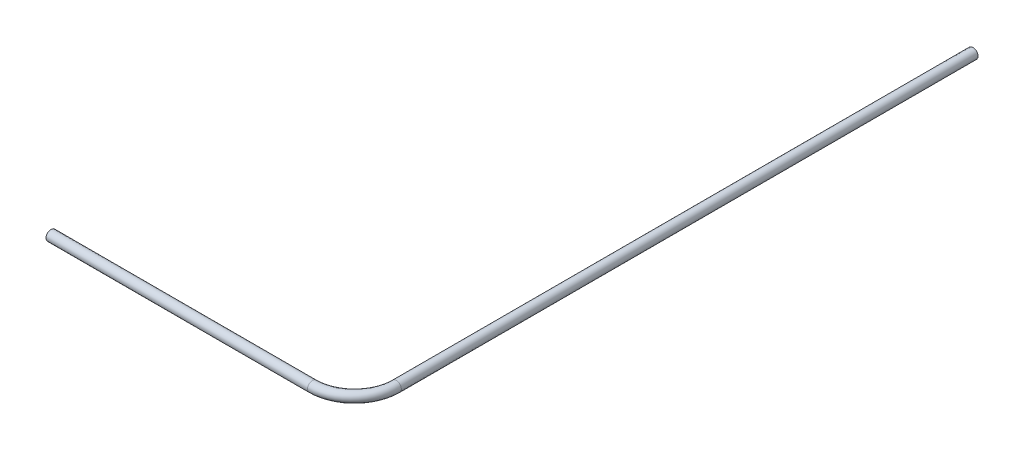
ISO-10303-21;
HEADER;
FILE_DESCRIPTION(('STEP AP214'),'2;1');
FILE_NAME('part.step','',(''),(''),'','','');
FILE_SCHEMA(('AUTOMOTIVE_DESIGN { 1 0 10303 214 1 1 1 1 }'));
ENDSEC;
DATA;
#1=APPLICATION_CONTEXT('core data for automotive mechanical design processes');
#2=APPLICATION_PROTOCOL_DEFINITION('international standard','automotive_design',2000,#1);
#3=PRODUCT_CONTEXT('',#1,'mechanical');
#4=PRODUCT('Part','Part','',(#3));
#5=PRODUCT_RELATED_PRODUCT_CATEGORY('part','',(#4));
#6=PRODUCT_DEFINITION_FORMATION('','',#4);
#7=PRODUCT_DEFINITION_CONTEXT('part definition',#1,'design');
#8=PRODUCT_DEFINITION('design','',#6,#7);
#9=PRODUCT_DEFINITION_SHAPE('','',#8);
#10=(LENGTH_UNIT() NAMED_UNIT(*) SI_UNIT(.MILLI.,.METRE.));
#11=(NAMED_UNIT(*) PLANE_ANGLE_UNIT() SI_UNIT($,.RADIAN.));
#12=(NAMED_UNIT(*) SI_UNIT($,.STERADIAN.) SOLID_ANGLE_UNIT());
#13=UNCERTAINTY_MEASURE_WITH_UNIT(LENGTH_MEASURE(1.E-05),#10,'distance_accuracy_value','');
#14=(GEOMETRIC_REPRESENTATION_CONTEXT(3) GLOBAL_UNCERTAINTY_ASSIGNED_CONTEXT((#13)) GLOBAL_UNIT_ASSIGNED_CONTEXT((#10,
#11,#12)) REPRESENTATION_CONTEXT('',''));
#15=CARTESIAN_POINT('',(0.,0.,0.));
#16=DIRECTION('',(0.,0.,1.));
#17=DIRECTION('',(1.,0.,0.));
#18=AXIS2_PLACEMENT_3D('',#15,#16,#17);
#19=CARTESIAN_POINT('',(11.9999999999996,0.,0.));
#20=DIRECTION('',(0.,0.,1.));
#21=DIRECTION('',(1.,0.,0.));
#22=AXIS2_PLACEMENT_3D('',#19,#20,#21);
#23=PLANE('',#22);
#24=CARTESIAN_POINT('',(11.9999999999996,0.,0.));
#25=DIRECTION('',(0.,0.,1.));
#26=DIRECTION('',(1.,0.,0.));
#27=AXIS2_PLACEMENT_3D('',#24,#25,#26);
#28=CIRCLE('',#27,6.);
#29=CARTESIAN_POINT('',(17.9999999999996,0.,0.));
#30=VERTEX_POINT('',#29);
#31=EDGE_CURVE('E51',#30,#30,#28,.T.);
#32=ORIENTED_EDGE('',*,*,#31,.F.);
#33=EDGE_LOOP('',(#32));
#34=FACE_BOUND('',#33,.T.);
#35=ADVANCED_FACE('F32',(#34),#23,.F.);
#36=CARTESIAN_POINT('',(-350.,-3.10862446895044E-12,738.000000000004));
#37=DIRECTION('',(-1.,0.,0.));
#38=DIRECTION('',(0.,0.,1.));
#39=AXIS2_PLACEMENT_3D('',#36,#37,#38);
#40=PLANE('',#39);
#41=CARTESIAN_POINT('',(-350.,-3.10862446895044E-12,738.000000000004));
#42=DIRECTION('',(-1.,0.,0.));
#43=DIRECTION('',(0.,0.,1.));
#44=AXIS2_PLACEMENT_3D('',#41,#42,#43);
#45=CIRCLE('',#44,6.);
#46=CARTESIAN_POINT('',(-350.,-3.12261327906072E-12,744.000000000004));
#47=VERTEX_POINT('',#46);
#48=EDGE_CURVE('E10',#47,#47,#45,.T.);
#49=ORIENTED_EDGE('',*,*,#48,.T.);
#50=EDGE_LOOP('',(#49));
#51=FACE_BOUND('',#50,.T.);
#52=ADVANCED_FACE('F62',(#51),#40,.T.);
#53=CARTESIAN_POINT('',(11.9999999999996,0.,0.));
#54=DIRECTION('',(0.,0.,1.));
#55=DIRECTION('',(1.,0.,0.));
#56=AXIS2_PLACEMENT_3D('',#53,#54,#55);
#57=CYLINDRICAL_SURFACE('',#56,6.);
#58=CARTESIAN_POINT('',(12.0000000000031,-8.88178419700125E-13,688.000000000001));
#59=DIRECTION('',(0.,0.,1.));
#60=DIRECTION('',(1.,0.,0.));
#61=AXIS2_PLACEMENT_3D('',#58,#59,#60);
#62=CIRCLE('',#61,6.);
#63=CARTESIAN_POINT('',(18.0000000000024,-8.88178419700125E-13,688.000000000001));
#64=VERTEX_POINT('',#63);
#65=EDGE_CURVE('E45',#64,#64,#62,.T.);
#66=ORIENTED_EDGE('',*,*,#65,.F.);
#67=EDGE_LOOP('',(#66));
#68=FACE_BOUND('',#67,.T.);
#69=ORIENTED_EDGE('',*,*,#31,.T.);
#70=EDGE_LOOP('',(#69));
#71=FACE_BOUND('',#70,.T.);
#72=ADVANCED_FACE('F59',(#68,#71),#57,.T.);
#73=CARTESIAN_POINT('',(-37.9999999999976,-8.88178419700125E-13,688.000000000001));
#74=DIRECTION('',(0.,-1.,0.));
#75=DIRECTION('',(0.,0.,-1.));
#76=AXIS2_PLACEMENT_3D('',#73,#74,#75);
#77=TOROIDAL_SURFACE('',#76,50.,6.);
#78=CARTESIAN_POINT('',(-37.9999999999976,-8.88178419700125E-13,738.));
#79=DIRECTION('',(-1.,0.,0.));
#80=DIRECTION('',(0.,0.,1.));
#81=AXIS2_PLACEMENT_3D('',#78,#79,#80);
#82=CIRCLE('',#81,6.);
#83=CARTESIAN_POINT('',(-37.9999999999976,-8.88178419700125E-13,744.000000000001));
#84=VERTEX_POINT('',#83);
#85=EDGE_CURVE('E39',#84,#84,#82,.T.);
#86=CARTESIAN_POINT('',(-37.9999999999976,-8.88178419700125E-13,688.000000000001));
#87=DIRECTION('',(0.,-1.,0.));
#88=DIRECTION('',(0.,0.,-1.));
#89=AXIS2_PLACEMENT_3D('',#86,#87,#88);
#90=CIRCLE('',#89,56.);
#91=EDGE_CURVE('',#64,#84,#90,.T.);
#92=ORIENTED_EDGE('',*,*,#65,.T.);
#93=ORIENTED_EDGE('',*,*,#85,.F.);
#94=ORIENTED_EDGE('',*,*,#91,.T.);
#95=ORIENTED_EDGE('',*,*,#91,.F.);
#96=EDGE_LOOP('',(#92,#94,#93,#95));
#97=FACE_BOUND('',#96,.T.);
#98=ADVANCED_FACE('F68',(#97),#77,.T.);
#99=CARTESIAN_POINT('',(-37.9999999999976,-8.88178419700125E-13,738.));
#100=DIRECTION('',(-1.,0.,0.));
#101=DIRECTION('',(0.,0.,1.));
#102=AXIS2_PLACEMENT_3D('',#99,#100,#101);
#103=CYLINDRICAL_SURFACE('',#102,6.);
#104=ORIENTED_EDGE('',*,*,#48,.F.);
#105=EDGE_LOOP('',(#104));
#106=FACE_BOUND('',#105,.T.);
#107=ORIENTED_EDGE('',*,*,#85,.T.);
#108=EDGE_LOOP('',(#107));
#109=FACE_BOUND('',#108,.T.);
#110=ADVANCED_FACE('F66',(#106,#109),#103,.T.);
#111=CLOSED_SHELL('',(#35,#52,#72,#98,#110));
#112=MANIFOLD_SOLID_BREP('B2',#111);
#113=ADVANCED_BREP_SHAPE_REPRESENTATION('',(#18,#112),#14);
#114=SHAPE_DEFINITION_REPRESENTATION(#9,#113);
ENDSEC;
END-ISO-10303-21;
